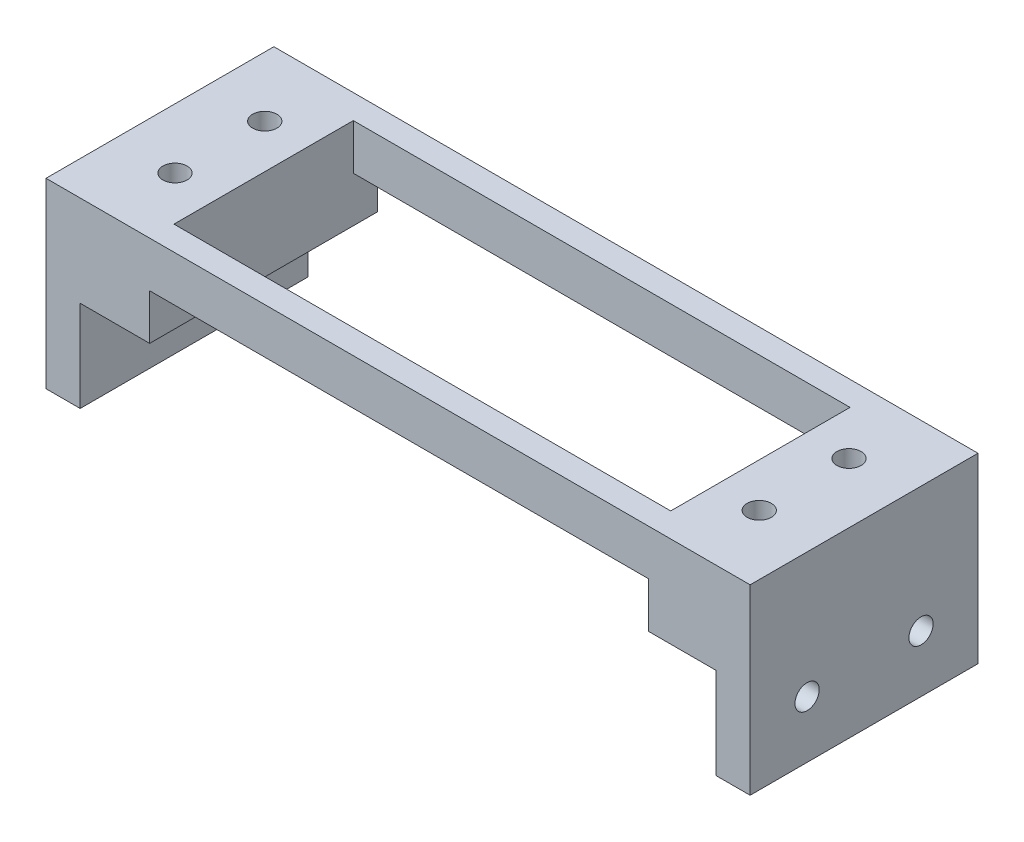
ISO-10303-21;
HEADER;
FILE_DESCRIPTION(('STEP AP214'),'2;1');
FILE_NAME('part.step','',(''),(''),'','','');
FILE_SCHEMA(('AUTOMOTIVE_DESIGN { 1 0 10303 214 1 1 1 1 }'));
ENDSEC;
DATA;
#1=APPLICATION_CONTEXT('core data for automotive mechanical design processes');
#2=APPLICATION_PROTOCOL_DEFINITION('international standard','automotive_design',2000,#1);
#3=PRODUCT_CONTEXT('',#1,'mechanical');
#4=PRODUCT('Part','Part','',(#3));
#5=PRODUCT_RELATED_PRODUCT_CATEGORY('part','',(#4));
#6=PRODUCT_DEFINITION_FORMATION('','',#4);
#7=PRODUCT_DEFINITION_CONTEXT('part definition',#1,'design');
#8=PRODUCT_DEFINITION('design','',#6,#7);
#9=PRODUCT_DEFINITION_SHAPE('','',#8);
#10=(LENGTH_UNIT() NAMED_UNIT(*) SI_UNIT(.MILLI.,.METRE.));
#11=(NAMED_UNIT(*) PLANE_ANGLE_UNIT() SI_UNIT($,.RADIAN.));
#12=(NAMED_UNIT(*) SI_UNIT($,.STERADIAN.) SOLID_ANGLE_UNIT());
#13=UNCERTAINTY_MEASURE_WITH_UNIT(LENGTH_MEASURE(1.E-05),#10,'distance_accuracy_value','');
#14=(GEOMETRIC_REPRESENTATION_CONTEXT(3) GLOBAL_UNCERTAINTY_ASSIGNED_CONTEXT((#13)) GLOBAL_UNIT_ASSIGNED_CONTEXT((#10,
#11,#12)) REPRESENTATION_CONTEXT('',''));
#15=CARTESIAN_POINT('',(0.,0.,0.));
#16=DIRECTION('',(0.,0.,1.));
#17=DIRECTION('',(1.,0.,0.));
#18=AXIS2_PLACEMENT_3D('',#15,#16,#17);
#19=CARTESIAN_POINT('',(0.,0.,0.));
#20=DIRECTION('',(0.,1.,0.));
#21=DIRECTION('',(0.,0.,1.));
#22=AXIS2_PLACEMENT_3D('',#19,#20,#21);
#23=PLANE('',#22);
#24=DIRECTION('',(0.,0.,-1.));
#25=VECTOR('',#24,1.);
#26=CARTESIAN_POINT('',(27.909175520648,0.,12.7));
#27=LINE('',#26,#25);
#28=CARTESIAN_POINT('',(27.909175520648,0.,12.7));
#29=VERTEX_POINT('',#28);
#30=CARTESIAN_POINT('',(27.909175520648,0.,-12.7));
#31=VERTEX_POINT('',#30);
#32=EDGE_CURVE('E199',#29,#31,#27,.T.);
#33=ORIENTED_EDGE('',*,*,#32,.F.);
#34=DIRECTION('',(1.,0.,0.));
#35=VECTOR('',#34,1.);
#36=CARTESIAN_POINT('',(35.433,0.,12.7));
#37=LINE('',#36,#35);
#38=CARTESIAN_POINT('',(-27.686,0.,12.7));
#39=VERTEX_POINT('',#38);
#40=EDGE_CURVE('E263',#39,#29,#37,.T.);
#41=ORIENTED_EDGE('',*,*,#40,.F.);
#42=DIRECTION('',(0.,0.,1.));
#43=VECTOR('',#42,1.);
#44=CARTESIAN_POINT('',(-27.686,0.,12.7));
#45=LINE('',#44,#43);
#46=CARTESIAN_POINT('',(-27.686,0.,9.9949));
#47=VERTEX_POINT('',#46);
#48=EDGE_CURVE('E11',#47,#39,#45,.T.);
#49=ORIENTED_EDGE('',*,*,#48,.F.);
#50=DIRECTION('',(1.,0.,0.));
#51=VECTOR('',#50,1.);
#52=CARTESIAN_POINT('',(27.686,0.,9.9949));
#53=LINE('',#52,#51);
#54=CARTESIAN_POINT('',(27.686,0.,9.9949));
#55=VERTEX_POINT('',#54);
#56=EDGE_CURVE('E236',#47,#55,#53,.T.);
#57=ORIENTED_EDGE('',*,*,#56,.T.);
#58=DIRECTION('',(0.,0.,-1.));
#59=VECTOR('',#58,1.);
#60=CARTESIAN_POINT('',(27.686,0.,9.9949));
#61=LINE('',#60,#59);
#62=CARTESIAN_POINT('',(27.686,0.,-9.9949));
#63=VERTEX_POINT('',#62);
#64=EDGE_CURVE('E250',#55,#63,#61,.T.);
#65=ORIENTED_EDGE('',*,*,#64,.T.);
#66=DIRECTION('',(-1.,0.,0.));
#67=VECTOR('',#66,1.);
#68=CARTESIAN_POINT('',(27.686,0.,-9.9949));
#69=LINE('',#68,#67);
#70=CARTESIAN_POINT('',(-27.686,0.,-9.99489999999999));
#71=VERTEX_POINT('',#70);
#72=EDGE_CURVE('E240',#63,#71,#69,.T.);
#73=ORIENTED_EDGE('',*,*,#72,.T.);
#74=CARTESIAN_POINT('',(-27.686,0.,-12.7));
#75=VERTEX_POINT('',#74);
#76=EDGE_CURVE('E44',#75,#71,#45,.T.);
#77=ORIENTED_EDGE('',*,*,#76,.F.);
#78=DIRECTION('',(-1.,0.,0.));
#79=VECTOR('',#78,1.);
#80=CARTESIAN_POINT('',(35.433,0.,-12.7));
#81=LINE('',#80,#79);
#82=EDGE_CURVE('E37',#31,#75,#81,.T.);
#83=ORIENTED_EDGE('',*,*,#82,.F.);
#84=EDGE_LOOP('',(#33,#41,#49,#57,#65,#73,#77,#83));
#85=FACE_BOUND('',#84,.T.);
#86=ADVANCED_FACE('F33',(#85),#23,.F.);
#87=CARTESIAN_POINT('',(0.,5.08,0.));
#88=DIRECTION('',(0.,1.,0.));
#89=DIRECTION('',(0.,0.,1.));
#90=AXIS2_PLACEMENT_3D('',#87,#88,#89);
#91=PLANE('',#90);
#92=CARTESIAN_POINT('',(-32.5628,5.08,-5.00379999999999));
#93=DIRECTION('',(0.,1.,0.));
#94=DIRECTION('',(0.,0.,1.));
#95=AXIS2_PLACEMENT_3D('',#92,#93,#94);
#96=CIRCLE('',#95,1.35255);
#97=CARTESIAN_POINT('',(-32.5628,5.08,-3.65124999999999));
#98=VERTEX_POINT('',#97);
#99=EDGE_CURVE('E331',#98,#98,#96,.T.);
#100=ORIENTED_EDGE('',*,*,#99,.F.);
#101=EDGE_LOOP('',(#100));
#102=FACE_BOUND('',#101,.T.);
#103=CARTESIAN_POINT('',(-32.5628,5.08,5.00380000000001));
#104=DIRECTION('',(0.,1.,0.));
#105=DIRECTION('',(0.,0.,1.));
#106=AXIS2_PLACEMENT_3D('',#103,#104,#105);
#107=CIRCLE('',#106,1.35255);
#108=CARTESIAN_POINT('',(-32.5628,5.08,6.35635000000001));
#109=VERTEX_POINT('',#108);
#110=EDGE_CURVE('E325',#109,#109,#107,.T.);
#111=ORIENTED_EDGE('',*,*,#110,.F.);
#112=EDGE_LOOP('',(#111));
#113=FACE_BOUND('',#112,.T.);
#114=CARTESIAN_POINT('',(32.5628000000001,5.08,-5.0038));
#115=DIRECTION('',(0.,1.,0.));
#116=DIRECTION('',(0.,0.,1.));
#117=AXIS2_PLACEMENT_3D('',#114,#115,#116);
#118=CIRCLE('',#117,1.35255);
#119=CARTESIAN_POINT('',(32.5628000000001,5.08,-3.65125));
#120=VERTEX_POINT('',#119);
#121=EDGE_CURVE('E319',#120,#120,#118,.T.);
#122=ORIENTED_EDGE('',*,*,#121,.F.);
#123=EDGE_LOOP('',(#122));
#124=FACE_BOUND('',#123,.T.);
#125=CARTESIAN_POINT('',(32.5628000000001,5.08,5.0038));
#126=DIRECTION('',(0.,1.,0.));
#127=DIRECTION('',(0.,0.,1.));
#128=AXIS2_PLACEMENT_3D('',#125,#126,#127);
#129=CIRCLE('',#128,1.35255);
#130=CARTESIAN_POINT('',(32.5628000000001,5.08,6.35635));
#131=VERTEX_POINT('',#130);
#132=EDGE_CURVE('E310',#131,#131,#129,.T.);
#133=ORIENTED_EDGE('',*,*,#132,.F.);
#134=EDGE_LOOP('',(#133));
#135=FACE_BOUND('',#134,.T.);
#136=DIRECTION('',(-1.,0.,0.));
#137=VECTOR('',#136,1.);
#138=CARTESIAN_POINT('',(35.433,5.08,-12.7));
#139=LINE('',#138,#137);
#140=CARTESIAN_POINT('',(39.243,5.08,-12.7));
#141=VERTEX_POINT('',#140);
#142=CARTESIAN_POINT('',(-39.243,5.08,-12.7));
#143=VERTEX_POINT('',#142);
#144=EDGE_CURVE('E42',#141,#143,#139,.T.);
#145=ORIENTED_EDGE('',*,*,#144,.T.);
#146=DIRECTION('',(0.,0.,1.));
#147=VECTOR('',#146,1.);
#148=CARTESIAN_POINT('',(-39.243,5.08,-12.7));
#149=LINE('',#148,#147);
#150=CARTESIAN_POINT('',(-39.243,5.08,12.7));
#151=VERTEX_POINT('',#150);
#152=EDGE_CURVE('E153',#143,#151,#149,.T.);
#153=ORIENTED_EDGE('',*,*,#152,.T.);
#154=DIRECTION('',(1.,0.,0.));
#155=VECTOR('',#154,1.);
#156=CARTESIAN_POINT('',(35.433,5.08,12.7));
#157=LINE('',#156,#155);
#158=CARTESIAN_POINT('',(39.243,5.08,12.7));
#159=VERTEX_POINT('',#158);
#160=EDGE_CURVE('E158',#151,#159,#157,.T.);
#161=ORIENTED_EDGE('',*,*,#160,.T.);
#162=DIRECTION('',(0.,0.,1.));
#163=VECTOR('',#162,1.);
#164=CARTESIAN_POINT('',(39.243,5.08,-12.7));
#165=LINE('',#164,#163);
#166=EDGE_CURVE('E155',#141,#159,#165,.T.);
#167=ORIENTED_EDGE('',*,*,#166,.F.);
#168=EDGE_LOOP('',(#145,#153,#161,#167));
#169=FACE_BOUND('',#168,.T.);
#170=DIRECTION('',(1.,0.,0.));
#171=VECTOR('',#170,1.);
#172=CARTESIAN_POINT('',(27.686,5.08,9.9949));
#173=LINE('',#172,#171);
#174=CARTESIAN_POINT('',(-27.686,5.08,9.9949));
#175=VERTEX_POINT('',#174);
#176=CARTESIAN_POINT('',(27.686,5.08,9.9949));
#177=VERTEX_POINT('',#176);
#178=EDGE_CURVE('E239',#175,#177,#173,.T.);
#179=ORIENTED_EDGE('',*,*,#178,.F.);
#180=DIRECTION('',(0.,0.,1.));
#181=VECTOR('',#180,1.);
#182=CARTESIAN_POINT('',(-27.686,5.08,9.9949));
#183=LINE('',#182,#181);
#184=CARTESIAN_POINT('',(-27.686,5.08,-9.99489999999999));
#185=VERTEX_POINT('',#184);
#186=EDGE_CURVE('E237',#185,#175,#183,.T.);
#187=ORIENTED_EDGE('',*,*,#186,.F.);
#188=DIRECTION('',(-1.,0.,0.));
#189=VECTOR('',#188,1.);
#190=CARTESIAN_POINT('',(27.686,5.08,-9.9949));
#191=LINE('',#190,#189);
#192=CARTESIAN_POINT('',(27.686,5.08,-9.9949));
#193=VERTEX_POINT('',#192);
#194=EDGE_CURVE('E245',#193,#185,#191,.T.);
#195=ORIENTED_EDGE('',*,*,#194,.F.);
#196=DIRECTION('',(0.,0.,-1.));
#197=VECTOR('',#196,1.);
#198=CARTESIAN_POINT('',(27.686,5.08,9.9949));
#199=LINE('',#198,#197);
#200=EDGE_CURVE('E242',#177,#193,#199,.T.);
#201=ORIENTED_EDGE('',*,*,#200,.F.);
#202=EDGE_LOOP('',(#179,#187,#195,#201));
#203=FACE_BOUND('',#202,.T.);
#204=ADVANCED_FACE('F150',(#102,#113,#124,#135,#169,#203),#91,.T.);
#205=CARTESIAN_POINT('',(35.433,5.08,12.7));
#206=DIRECTION('',(0.,0.,-1.));
#207=DIRECTION('',(-1.,0.,0.));
#208=AXIS2_PLACEMENT_3D('',#205,#206,#207);
#209=PLANE('',#208);
#210=ORIENTED_EDGE('',*,*,#160,.F.);
#211=DIRECTION('',(0.,1.,0.));
#212=VECTOR('',#211,1.);
#213=CARTESIAN_POINT('',(-39.243,-5.08,12.7));
#214=LINE('',#213,#212);
#215=CARTESIAN_POINT('',(-39.243,-15.24,12.7));
#216=VERTEX_POINT('',#215);
#217=EDGE_CURVE('E173',#216,#151,#214,.T.);
#218=ORIENTED_EDGE('',*,*,#217,.F.);
#219=DIRECTION('',(-1.,0.,0.));
#220=VECTOR('',#219,1.);
#221=CARTESIAN_POINT('',(-39.243,-15.24,12.7));
#222=LINE('',#221,#220);
#223=CARTESIAN_POINT('',(-35.433,-15.24,12.7));
#224=VERTEX_POINT('',#223);
#225=EDGE_CURVE('E300',#224,#216,#222,.T.);
#226=ORIENTED_EDGE('',*,*,#225,.F.);
#227=DIRECTION('',(0.,-1.,0.));
#228=VECTOR('',#227,1.);
#229=CARTESIAN_POINT('',(-35.433,5.08,12.7));
#230=LINE('',#229,#228);
#231=CARTESIAN_POINT('',(-35.433,-5.08,12.7));
#232=VERTEX_POINT('',#231);
#233=EDGE_CURVE('E168',#232,#224,#230,.T.);
#234=ORIENTED_EDGE('',*,*,#233,.F.);
#235=DIRECTION('',(-1.,0.,0.));
#236=VECTOR('',#235,1.);
#237=CARTESIAN_POINT('',(-35.433,-5.08,12.7));
#238=LINE('',#237,#236);
#239=CARTESIAN_POINT('',(-27.686,-5.08,12.7));
#240=VERTEX_POINT('',#239);
#241=EDGE_CURVE('E226',#240,#232,#238,.T.);
#242=ORIENTED_EDGE('',*,*,#241,.F.);
#243=DIRECTION('',(0.,1.,0.));
#244=VECTOR('',#243,1.);
#245=CARTESIAN_POINT('',(-27.686,-5.08,12.7));
#246=LINE('',#245,#244);
#247=EDGE_CURVE('E228',#240,#39,#246,.T.);
#248=ORIENTED_EDGE('',*,*,#247,.T.);
#249=ORIENTED_EDGE('',*,*,#40,.T.);
#250=DIRECTION('',(0.,1.,0.));
#251=VECTOR('',#250,1.);
#252=CARTESIAN_POINT('',(27.909175520648,-5.08,12.7));
#253=LINE('',#252,#251);
#254=CARTESIAN_POINT('',(27.909175520648,-5.08,12.7));
#255=VERTEX_POINT('',#254);
#256=EDGE_CURVE('E217',#255,#29,#253,.T.);
#257=ORIENTED_EDGE('',*,*,#256,.F.);
#258=DIRECTION('',(-1.,0.,0.));
#259=VECTOR('',#258,1.);
#260=CARTESIAN_POINT('',(35.433,-5.08,12.7));
#261=LINE('',#260,#259);
#262=CARTESIAN_POINT('',(35.433,-5.08,12.7));
#263=VERTEX_POINT('',#262);
#264=EDGE_CURVE('E208',#263,#255,#261,.T.);
#265=ORIENTED_EDGE('',*,*,#264,.F.);
#266=DIRECTION('',(0.,-1.,0.));
#267=VECTOR('',#266,1.);
#268=CARTESIAN_POINT('',(35.433,5.08,12.7));
#269=LINE('',#268,#267);
#270=CARTESIAN_POINT('',(35.433,-15.24,12.7));
#271=VERTEX_POINT('',#270);
#272=EDGE_CURVE('E191',#263,#271,#269,.T.);
#273=ORIENTED_EDGE('',*,*,#272,.T.);
#274=DIRECTION('',(1.,0.,0.));
#275=VECTOR('',#274,1.);
#276=CARTESIAN_POINT('',(39.243,-15.24,12.7));
#277=LINE('',#276,#275);
#278=CARTESIAN_POINT('',(39.243,-15.24,12.7));
#279=VERTEX_POINT('',#278);
#280=EDGE_CURVE('E193',#271,#279,#277,.T.);
#281=ORIENTED_EDGE('',*,*,#280,.T.);
#282=DIRECTION('',(0.,1.,0.));
#283=VECTOR('',#282,1.);
#284=CARTESIAN_POINT('',(39.243,5.08,12.7));
#285=LINE('',#284,#283);
#286=EDGE_CURVE('E185',#279,#159,#285,.T.);
#287=ORIENTED_EDGE('',*,*,#286,.T.);
#288=EDGE_LOOP('',(#210,#218,#226,#234,#242,#248,#249,#257,#265,#273,#281,#287));
#289=FACE_BOUND('',#288,.T.);
#290=ADVANCED_FACE('F35',(#289),#209,.F.);
#291=CARTESIAN_POINT('',(35.433,5.08,-12.7));
#292=DIRECTION('',(0.,0.,1.));
#293=DIRECTION('',(1.,0.,0.));
#294=AXIS2_PLACEMENT_3D('',#291,#292,#293);
#295=PLANE('',#294);
#296=ORIENTED_EDGE('',*,*,#144,.F.);
#297=DIRECTION('',(0.,1.,0.));
#298=VECTOR('',#297,1.);
#299=CARTESIAN_POINT('',(39.243,-5.08,-12.7));
#300=LINE('',#299,#298);
#301=CARTESIAN_POINT('',(39.243,-15.24,-12.7));
#302=VERTEX_POINT('',#301);
#303=EDGE_CURVE('E188',#302,#141,#300,.T.);
#304=ORIENTED_EDGE('',*,*,#303,.F.);
#305=DIRECTION('',(1.,0.,0.));
#306=VECTOR('',#305,1.);
#307=CARTESIAN_POINT('',(39.243,-15.24,-12.7));
#308=LINE('',#307,#306);
#309=CARTESIAN_POINT('',(35.433,-15.24,-12.7));
#310=VERTEX_POINT('',#309);
#311=EDGE_CURVE('E184',#310,#302,#308,.T.);
#312=ORIENTED_EDGE('',*,*,#311,.F.);
#313=DIRECTION('',(0.,-1.,0.));
#314=VECTOR('',#313,1.);
#315=CARTESIAN_POINT('',(35.433,5.08,-12.7));
#316=LINE('',#315,#314);
#317=CARTESIAN_POINT('',(35.433,-5.08,-12.7));
#318=VERTEX_POINT('',#317);
#319=EDGE_CURVE('E182',#318,#310,#316,.T.);
#320=ORIENTED_EDGE('',*,*,#319,.F.);
#321=DIRECTION('',(1.,0.,0.));
#322=VECTOR('',#321,1.);
#323=CARTESIAN_POINT('',(35.433,-5.08,-12.7));
#324=LINE('',#323,#322);
#325=CARTESIAN_POINT('',(27.909175520648,-5.08,-12.7));
#326=VERTEX_POINT('',#325);
#327=EDGE_CURVE('E212',#326,#318,#324,.T.);
#328=ORIENTED_EDGE('',*,*,#327,.F.);
#329=DIRECTION('',(0.,1.,0.));
#330=VECTOR('',#329,1.);
#331=CARTESIAN_POINT('',(27.909175520648,-5.08,-12.7));
#332=LINE('',#331,#330);
#333=EDGE_CURVE('E51',#326,#31,#332,.T.);
#334=ORIENTED_EDGE('',*,*,#333,.T.);
#335=ORIENTED_EDGE('',*,*,#82,.T.);
#336=DIRECTION('',(0.,1.,0.));
#337=VECTOR('',#336,1.);
#338=CARTESIAN_POINT('',(-27.686,-5.08,-12.7));
#339=LINE('',#338,#337);
#340=CARTESIAN_POINT('',(-27.686,-5.08,-12.7));
#341=VERTEX_POINT('',#340);
#342=EDGE_CURVE('E233',#341,#75,#339,.T.);
#343=ORIENTED_EDGE('',*,*,#342,.F.);
#344=DIRECTION('',(1.,0.,0.));
#345=VECTOR('',#344,1.);
#346=CARTESIAN_POINT('',(-35.433,-5.08,-12.7));
#347=LINE('',#346,#345);
#348=CARTESIAN_POINT('',(-35.433,-5.08,-12.7));
#349=VERTEX_POINT('',#348);
#350=EDGE_CURVE('E222',#349,#341,#347,.T.);
#351=ORIENTED_EDGE('',*,*,#350,.F.);
#352=DIRECTION('',(0.,-1.,0.));
#353=VECTOR('',#352,1.);
#354=CARTESIAN_POINT('',(-35.433,5.08,-12.7));
#355=LINE('',#354,#353);
#356=CARTESIAN_POINT('',(-35.433,-15.24,-12.7));
#357=VERTEX_POINT('',#356);
#358=EDGE_CURVE('E175',#349,#357,#355,.T.);
#359=ORIENTED_EDGE('',*,*,#358,.T.);
#360=DIRECTION('',(-1.,0.,0.));
#361=VECTOR('',#360,1.);
#362=CARTESIAN_POINT('',(-39.243,-15.24,-12.7));
#363=LINE('',#362,#361);
#364=CARTESIAN_POINT('',(-39.243,-15.24,-12.7));
#365=VERTEX_POINT('',#364);
#366=EDGE_CURVE('E164',#357,#365,#363,.T.);
#367=ORIENTED_EDGE('',*,*,#366,.T.);
#368=DIRECTION('',(0.,1.,0.));
#369=VECTOR('',#368,1.);
#370=CARTESIAN_POINT('',(-39.243,5.08,-12.7));
#371=LINE('',#370,#369);
#372=EDGE_CURVE('E161',#365,#143,#371,.T.);
#373=ORIENTED_EDGE('',*,*,#372,.T.);
#374=EDGE_LOOP('',(#296,#304,#312,#320,#328,#334,#335,#343,#351,#359,#367,#373));
#375=FACE_BOUND('',#374,.T.);
#376=ADVANCED_FACE('F162',(#375),#295,.F.);
#377=CARTESIAN_POINT('',(-27.686,5.08,9.9949));
#378=DIRECTION('',(1.,0.,0.));
#379=DIRECTION('',(0.,0.,-1.));
#380=AXIS2_PLACEMENT_3D('',#377,#378,#379);
#381=PLANE('',#380);
#382=DIRECTION('',(0.,-1.,0.));
#383=VECTOR('',#382,1.);
#384=CARTESIAN_POINT('',(-27.686,5.08,9.9949));
#385=LINE('',#384,#383);
#386=EDGE_CURVE('E260',#175,#47,#385,.T.);
#387=ORIENTED_EDGE('',*,*,#386,.T.);
#388=ORIENTED_EDGE('',*,*,#48,.T.);
#389=ORIENTED_EDGE('',*,*,#247,.F.);
#390=DIRECTION('',(0.,0.,1.));
#391=VECTOR('',#390,1.);
#392=CARTESIAN_POINT('',(-27.686,-5.08,12.7));
#393=LINE('',#392,#391);
#394=EDGE_CURVE('E224',#341,#240,#393,.T.);
#395=ORIENTED_EDGE('',*,*,#394,.F.);
#396=ORIENTED_EDGE('',*,*,#342,.T.);
#397=ORIENTED_EDGE('',*,*,#76,.T.);
#398=DIRECTION('',(0.,-1.,0.));
#399=VECTOR('',#398,1.);
#400=CARTESIAN_POINT('',(-27.686,5.08,-9.99489999999999));
#401=LINE('',#400,#399);
#402=EDGE_CURVE('E247',#185,#71,#401,.T.);
#403=ORIENTED_EDGE('',*,*,#402,.F.);
#404=ORIENTED_EDGE('',*,*,#186,.T.);
#405=EDGE_LOOP('',(#387,#388,#389,#395,#396,#397,#403,#404));
#406=FACE_BOUND('',#405,.T.);
#407=ADVANCED_FACE('F275',(#406),#381,.T.);
#408=CARTESIAN_POINT('',(27.686,5.08,9.9949));
#409=DIRECTION('',(0.,0.,-1.));
#410=DIRECTION('',(-1.,0.,0.));
#411=AXIS2_PLACEMENT_3D('',#408,#409,#410);
#412=PLANE('',#411);
#413=ORIENTED_EDGE('',*,*,#56,.F.);
#414=ORIENTED_EDGE('',*,*,#386,.F.);
#415=ORIENTED_EDGE('',*,*,#178,.T.);
#416=DIRECTION('',(0.,-1.,0.));
#417=VECTOR('',#416,1.);
#418=CARTESIAN_POINT('',(27.686,5.08,9.9949));
#419=LINE('',#418,#417);
#420=EDGE_CURVE('E258',#177,#55,#419,.T.);
#421=ORIENTED_EDGE('',*,*,#420,.T.);
#422=EDGE_LOOP('',(#413,#414,#415,#421));
#423=FACE_BOUND('',#422,.T.);
#424=ADVANCED_FACE('F282',(#423),#412,.T.);
#425=CARTESIAN_POINT('',(27.686,5.08,9.9949));
#426=DIRECTION('',(-1.,0.,0.));
#427=DIRECTION('',(0.,0.,1.));
#428=AXIS2_PLACEMENT_3D('',#425,#426,#427);
#429=PLANE('',#428);
#430=ORIENTED_EDGE('',*,*,#64,.F.);
#431=ORIENTED_EDGE('',*,*,#420,.F.);
#432=ORIENTED_EDGE('',*,*,#200,.T.);
#433=DIRECTION('',(0.,-1.,0.));
#434=VECTOR('',#433,1.);
#435=CARTESIAN_POINT('',(27.686,5.08,-9.9949));
#436=LINE('',#435,#434);
#437=EDGE_CURVE('E256',#193,#63,#436,.T.);
#438=ORIENTED_EDGE('',*,*,#437,.T.);
#439=EDGE_LOOP('',(#430,#431,#432,#438));
#440=FACE_BOUND('',#439,.T.);
#441=ADVANCED_FACE('F288',(#440),#429,.T.);
#442=CARTESIAN_POINT('',(27.686,5.08,-9.9949));
#443=DIRECTION('',(0.,0.,1.));
#444=DIRECTION('',(1.,0.,0.));
#445=AXIS2_PLACEMENT_3D('',#442,#443,#444);
#446=PLANE('',#445);
#447=ORIENTED_EDGE('',*,*,#72,.F.);
#448=ORIENTED_EDGE('',*,*,#437,.F.);
#449=ORIENTED_EDGE('',*,*,#194,.T.);
#450=ORIENTED_EDGE('',*,*,#402,.T.);
#451=EDGE_LOOP('',(#447,#448,#449,#450));
#452=FACE_BOUND('',#451,.T.);
#453=ADVANCED_FACE('F387',(#452),#446,.T.);
#454=CARTESIAN_POINT('',(0.,-5.08,0.));
#455=DIRECTION('',(0.,-1.,0.));
#456=DIRECTION('',(0.,0.,-1.));
#457=AXIS2_PLACEMENT_3D('',#454,#455,#456);
#458=PLANE('',#457);
#459=CARTESIAN_POINT('',(-32.5628,-5.08,-5.00379999999999));
#460=DIRECTION('',(0.,1.,0.));
#461=DIRECTION('',(0.,0.,1.));
#462=AXIS2_PLACEMENT_3D('',#459,#460,#461);
#463=CIRCLE('',#462,1.35255);
#464=CARTESIAN_POINT('',(-32.5628,-5.08,-3.65124999999999));
#465=VERTEX_POINT('',#464);
#466=EDGE_CURVE('E328',#465,#465,#463,.T.);
#467=ORIENTED_EDGE('',*,*,#466,.T.);
#468=EDGE_LOOP('',(#467));
#469=FACE_BOUND('',#468,.T.);
#470=CARTESIAN_POINT('',(-32.5628,-5.08,5.00380000000001));
#471=DIRECTION('',(0.,1.,0.));
#472=DIRECTION('',(0.,0.,1.));
#473=AXIS2_PLACEMENT_3D('',#470,#471,#472);
#474=CIRCLE('',#473,1.35255);
#475=CARTESIAN_POINT('',(-32.5628,-5.08,6.35635000000001));
#476=VERTEX_POINT('',#475);
#477=EDGE_CURVE('E322',#476,#476,#474,.T.);
#478=ORIENTED_EDGE('',*,*,#477,.T.);
#479=EDGE_LOOP('',(#478));
#480=FACE_BOUND('',#479,.T.);
#481=DIRECTION('',(0.,0.,-1.));
#482=VECTOR('',#481,1.);
#483=CARTESIAN_POINT('',(-35.433,-5.08,12.7));
#484=LINE('',#483,#482);
#485=EDGE_CURVE('E219',#232,#349,#484,.T.);
#486=ORIENTED_EDGE('',*,*,#485,.T.);
#487=ORIENTED_EDGE('',*,*,#350,.T.);
#488=ORIENTED_EDGE('',*,*,#394,.T.);
#489=ORIENTED_EDGE('',*,*,#241,.T.);
#490=EDGE_LOOP('',(#486,#487,#488,#489));
#491=FACE_BOUND('',#490,.T.);
#492=ADVANCED_FACE('F294',(#469,#480,#491),#458,.T.);
#493=CARTESIAN_POINT('',(27.909175520648,-5.08,12.7));
#494=DIRECTION('',(1.,0.,0.));
#495=DIRECTION('',(0.,0.,-1.));
#496=AXIS2_PLACEMENT_3D('',#493,#494,#495);
#497=PLANE('',#496);
#498=ORIENTED_EDGE('',*,*,#32,.T.);
#499=ORIENTED_EDGE('',*,*,#333,.F.);
#500=DIRECTION('',(0.,0.,-1.));
#501=VECTOR('',#500,1.);
#502=CARTESIAN_POINT('',(27.909175520648,-5.08,12.7));
#503=LINE('',#502,#501);
#504=EDGE_CURVE('E210',#255,#326,#503,.T.);
#505=ORIENTED_EDGE('',*,*,#504,.F.);
#506=ORIENTED_EDGE('',*,*,#256,.T.);
#507=EDGE_LOOP('',(#498,#499,#505,#506));
#508=FACE_BOUND('',#507,.T.);
#509=ADVANCED_FACE('F378',(#508),#497,.F.);
#510=CARTESIAN_POINT('',(0.,-5.08,0.));
#511=DIRECTION('',(0.,1.,0.));
#512=DIRECTION('',(0.,0.,1.));
#513=AXIS2_PLACEMENT_3D('',#510,#511,#512);
#514=PLANE('',#513);
#515=CARTESIAN_POINT('',(32.5628000000001,-5.08,-5.0038));
#516=DIRECTION('',(0.,1.,0.));
#517=DIRECTION('',(0.,0.,1.));
#518=AXIS2_PLACEMENT_3D('',#515,#516,#517);
#519=CIRCLE('',#518,1.35254999999999);
#520=CARTESIAN_POINT('',(32.5628000000001,-5.08,-3.65125));
#521=VERTEX_POINT('',#520);
#522=EDGE_CURVE('E314',#521,#521,#519,.T.);
#523=ORIENTED_EDGE('',*,*,#522,.T.);
#524=EDGE_LOOP('',(#523));
#525=FACE_BOUND('',#524,.T.);
#526=CARTESIAN_POINT('',(32.5628000000001,-5.08,5.0038));
#527=DIRECTION('',(0.,1.,0.));
#528=DIRECTION('',(0.,0.,1.));
#529=AXIS2_PLACEMENT_3D('',#526,#527,#528);
#530=CIRCLE('',#529,1.35254999999999);
#531=CARTESIAN_POINT('',(32.5628000000001,-5.08,6.35635));
#532=VERTEX_POINT('',#531);
#533=EDGE_CURVE('E308',#532,#532,#530,.T.);
#534=ORIENTED_EDGE('',*,*,#533,.T.);
#535=EDGE_LOOP('',(#534));
#536=FACE_BOUND('',#535,.T.);
#537=DIRECTION('',(0.,0.,1.));
#538=VECTOR('',#537,1.);
#539=CARTESIAN_POINT('',(35.433,-5.08,12.7));
#540=LINE('',#539,#538);
#541=EDGE_CURVE('E205',#318,#263,#540,.T.);
#542=ORIENTED_EDGE('',*,*,#541,.T.);
#543=ORIENTED_EDGE('',*,*,#264,.T.);
#544=ORIENTED_EDGE('',*,*,#504,.T.);
#545=ORIENTED_EDGE('',*,*,#327,.T.);
#546=EDGE_LOOP('',(#542,#543,#544,#545));
#547=FACE_BOUND('',#546,.T.);
#548=ADVANCED_FACE('F376',(#525,#536,#547),#514,.F.);
#549=CARTESIAN_POINT('',(35.433,5.08,-12.7));
#550=DIRECTION('',(-1.,0.,0.));
#551=DIRECTION('',(0.,0.,1.));
#552=AXIS2_PLACEMENT_3D('',#549,#550,#551);
#553=PLANE('',#552);
#554=CARTESIAN_POINT('',(35.433,-8.89,-6.35));
#555=DIRECTION('',(-1.,0.,0.));
#556=DIRECTION('',(0.,0.,1.));
#557=AXIS2_PLACEMENT_3D('',#554,#555,#556);
#558=CIRCLE('',#557,1.35254999999999);
#559=CARTESIAN_POINT('',(35.433,-8.89,-4.99745000000001));
#560=VERTEX_POINT('',#559);
#561=EDGE_CURVE('E352',#560,#560,#558,.T.);
#562=ORIENTED_EDGE('',*,*,#561,.F.);
#563=EDGE_LOOP('',(#562));
#564=FACE_BOUND('',#563,.T.);
#565=CARTESIAN_POINT('',(35.433,-8.89,6.35));
#566=DIRECTION('',(-1.,0.,0.));
#567=DIRECTION('',(0.,0.,1.));
#568=AXIS2_PLACEMENT_3D('',#565,#566,#567);
#569=CIRCLE('',#568,1.35254999999999);
#570=CARTESIAN_POINT('',(35.433,-8.89,7.70254999999999));
#571=VERTEX_POINT('',#570);
#572=EDGE_CURVE('E346',#571,#571,#569,.T.);
#573=ORIENTED_EDGE('',*,*,#572,.F.);
#574=EDGE_LOOP('',(#573));
#575=FACE_BOUND('',#574,.T.);
#576=ORIENTED_EDGE('',*,*,#541,.F.);
#577=ORIENTED_EDGE('',*,*,#319,.T.);
#578=DIRECTION('',(0.,0.,1.));
#579=VECTOR('',#578,1.);
#580=CARTESIAN_POINT('',(35.433,-15.24,-12.7));
#581=LINE('',#580,#579);
#582=EDGE_CURVE('E190',#310,#271,#581,.T.);
#583=ORIENTED_EDGE('',*,*,#582,.T.);
#584=ORIENTED_EDGE('',*,*,#272,.F.);
#585=EDGE_LOOP('',(#576,#577,#583,#584));
#586=FACE_BOUND('',#585,.T.);
#587=ADVANCED_FACE('F365',(#564,#575,#586),#553,.T.);
#588=CARTESIAN_POINT('',(39.243,5.08,-12.7));
#589=DIRECTION('',(1.,0.,0.));
#590=DIRECTION('',(0.,0.,-1.));
#591=AXIS2_PLACEMENT_3D('',#588,#589,#590);
#592=PLANE('',#591);
#593=CARTESIAN_POINT('',(39.243,-8.89,-6.35));
#594=DIRECTION('',(1.,0.,0.));
#595=DIRECTION('',(0.,0.,-1.));
#596=AXIS2_PLACEMENT_3D('',#593,#594,#595);
#597=CIRCLE('',#596,1.35254999999999);
#598=CARTESIAN_POINT('',(39.243,-8.89,-7.70254999999999));
#599=VERTEX_POINT('',#598);
#600=EDGE_CURVE('E355',#599,#599,#597,.T.);
#601=ORIENTED_EDGE('',*,*,#600,.F.);
#602=EDGE_LOOP('',(#601));
#603=FACE_BOUND('',#602,.T.);
#604=CARTESIAN_POINT('',(39.243,-8.89,6.35));
#605=DIRECTION('',(1.,0.,0.));
#606=DIRECTION('',(0.,0.,-1.));
#607=AXIS2_PLACEMENT_3D('',#604,#605,#606);
#608=CIRCLE('',#607,1.35254999999999);
#609=CARTESIAN_POINT('',(39.243,-8.89,4.99745000000001));
#610=VERTEX_POINT('',#609);
#611=EDGE_CURVE('E349',#610,#610,#608,.T.);
#612=ORIENTED_EDGE('',*,*,#611,.F.);
#613=EDGE_LOOP('',(#612));
#614=FACE_BOUND('',#613,.T.);
#615=ORIENTED_EDGE('',*,*,#286,.F.);
#616=DIRECTION('',(0.,0.,1.));
#617=VECTOR('',#616,1.);
#618=CARTESIAN_POINT('',(39.243,-15.24,-12.7));
#619=LINE('',#618,#617);
#620=EDGE_CURVE('E200',#302,#279,#619,.T.);
#621=ORIENTED_EDGE('',*,*,#620,.F.);
#622=ORIENTED_EDGE('',*,*,#303,.T.);
#623=ORIENTED_EDGE('',*,*,#166,.T.);
#624=EDGE_LOOP('',(#615,#621,#622,#623));
#625=FACE_BOUND('',#624,.T.);
#626=ADVANCED_FACE('F361',(#603,#614,#625),#592,.T.);
#627=CARTESIAN_POINT('',(39.243,-15.24,-12.7));
#628=DIRECTION('',(0.,-1.,0.));
#629=DIRECTION('',(0.,0.,-1.));
#630=AXIS2_PLACEMENT_3D('',#627,#628,#629);
#631=PLANE('',#630);
#632=ORIENTED_EDGE('',*,*,#280,.F.);
#633=ORIENTED_EDGE('',*,*,#582,.F.);
#634=ORIENTED_EDGE('',*,*,#311,.T.);
#635=ORIENTED_EDGE('',*,*,#620,.T.);
#636=EDGE_LOOP('',(#632,#633,#634,#635));
#637=FACE_BOUND('',#636,.T.);
#638=ADVANCED_FACE('F364',(#637),#631,.T.);
#639=CARTESIAN_POINT('',(-35.433,5.08,-12.7));
#640=DIRECTION('',(-1.,0.,0.));
#641=DIRECTION('',(0.,0.,1.));
#642=AXIS2_PLACEMENT_3D('',#639,#640,#641);
#643=PLANE('',#642);
#644=CARTESIAN_POINT('',(-35.433,-8.89,-6.35));
#645=DIRECTION('',(-1.,0.,0.));
#646=DIRECTION('',(0.,0.,1.));
#647=AXIS2_PLACEMENT_3D('',#644,#645,#646);
#648=CIRCLE('',#647,1.35254999999999);
#649=CARTESIAN_POINT('',(-35.433,-8.89,-4.99745000000001));
#650=VERTEX_POINT('',#649);
#651=EDGE_CURVE('E340',#650,#650,#648,.T.);
#652=ORIENTED_EDGE('',*,*,#651,.T.);
#653=EDGE_LOOP('',(#652));
#654=FACE_BOUND('',#653,.T.);
#655=CARTESIAN_POINT('',(-35.433,-8.89,6.35));
#656=DIRECTION('',(-1.,0.,0.));
#657=DIRECTION('',(0.,0.,1.));
#658=AXIS2_PLACEMENT_3D('',#655,#656,#657);
#659=CIRCLE('',#658,1.35254999999999);
#660=CARTESIAN_POINT('',(-35.433,-8.89,7.70254999999999));
#661=VERTEX_POINT('',#660);
#662=EDGE_CURVE('E334',#661,#661,#659,.T.);
#663=ORIENTED_EDGE('',*,*,#662,.T.);
#664=EDGE_LOOP('',(#663));
#665=FACE_BOUND('',#664,.T.);
#666=ORIENTED_EDGE('',*,*,#485,.F.);
#667=ORIENTED_EDGE('',*,*,#233,.T.);
#668=DIRECTION('',(0.,0.,1.));
#669=VECTOR('',#668,1.);
#670=CARTESIAN_POINT('',(-35.433,-15.24,-12.7));
#671=LINE('',#670,#669);
#672=EDGE_CURVE('E177',#357,#224,#671,.T.);
#673=ORIENTED_EDGE('',*,*,#672,.F.);
#674=ORIENTED_EDGE('',*,*,#358,.F.);
#675=EDGE_LOOP('',(#666,#667,#673,#674));
#676=FACE_BOUND('',#675,.T.);
#677=ADVANCED_FACE('F297',(#654,#665,#676),#643,.F.);
#678=CARTESIAN_POINT('',(-39.243,-15.24,-12.7));
#679=DIRECTION('',(0.,1.,0.));
#680=DIRECTION('',(0.,0.,1.));
#681=AXIS2_PLACEMENT_3D('',#678,#679,#680);
#682=PLANE('',#681);
#683=ORIENTED_EDGE('',*,*,#225,.T.);
#684=DIRECTION('',(0.,0.,1.));
#685=VECTOR('',#684,1.);
#686=CARTESIAN_POINT('',(-39.243,-15.24,-12.7));
#687=LINE('',#686,#685);
#688=EDGE_CURVE('E174',#365,#216,#687,.T.);
#689=ORIENTED_EDGE('',*,*,#688,.F.);
#690=ORIENTED_EDGE('',*,*,#366,.F.);
#691=ORIENTED_EDGE('',*,*,#672,.T.);
#692=EDGE_LOOP('',(#683,#689,#690,#691));
#693=FACE_BOUND('',#692,.T.);
#694=ADVANCED_FACE('F305',(#693),#682,.F.);
#695=CARTESIAN_POINT('',(-39.243,-5.08,-12.7));
#696=DIRECTION('',(1.,0.,0.));
#697=DIRECTION('',(0.,0.,-1.));
#698=AXIS2_PLACEMENT_3D('',#695,#696,#697);
#699=PLANE('',#698);
#700=CARTESIAN_POINT('',(-39.243,-8.89,-6.35));
#701=DIRECTION('',(-1.,0.,0.));
#702=DIRECTION('',(0.,0.,1.));
#703=AXIS2_PLACEMENT_3D('',#700,#701,#702);
#704=CIRCLE('',#703,1.35254999999999);
#705=CARTESIAN_POINT('',(-39.243,-8.89,-4.99745000000001));
#706=VERTEX_POINT('',#705);
#707=EDGE_CURVE('E343',#706,#706,#704,.T.);
#708=ORIENTED_EDGE('',*,*,#707,.F.);
#709=EDGE_LOOP('',(#708));
#710=FACE_BOUND('',#709,.T.);
#711=CARTESIAN_POINT('',(-39.243,-8.89,6.35));
#712=DIRECTION('',(-1.,0.,0.));
#713=DIRECTION('',(0.,0.,1.));
#714=AXIS2_PLACEMENT_3D('',#711,#712,#713);
#715=CIRCLE('',#714,1.35254999999999);
#716=CARTESIAN_POINT('',(-39.243,-8.89,7.70254999999999));
#717=VERTEX_POINT('',#716);
#718=EDGE_CURVE('E337',#717,#717,#715,.T.);
#719=ORIENTED_EDGE('',*,*,#718,.F.);
#720=EDGE_LOOP('',(#719));
#721=FACE_BOUND('',#720,.T.);
#722=ORIENTED_EDGE('',*,*,#217,.T.);
#723=ORIENTED_EDGE('',*,*,#152,.F.);
#724=ORIENTED_EDGE('',*,*,#372,.F.);
#725=ORIENTED_EDGE('',*,*,#688,.T.);
#726=EDGE_LOOP('',(#722,#723,#724,#725));
#727=FACE_BOUND('',#726,.T.);
#728=ADVANCED_FACE('F171',(#710,#721,#727),#699,.F.);
#729=CARTESIAN_POINT('',(32.5628000000001,5.08,5.0038));
#730=DIRECTION('',(0.,1.,0.));
#731=DIRECTION('',(0.,0.,1.));
#732=AXIS2_PLACEMENT_3D('',#729,#730,#731);
#733=CYLINDRICAL_SURFACE('',#732,1.35255);
#734=ORIENTED_EDGE('',*,*,#533,.F.);
#735=EDGE_LOOP('',(#734));
#736=FACE_BOUND('',#735,.T.);
#737=ORIENTED_EDGE('',*,*,#132,.T.);
#738=EDGE_LOOP('',(#737));
#739=FACE_BOUND('',#738,.T.);
#740=ADVANCED_FACE('F437',(#736,#739),#733,.F.);
#741=CARTESIAN_POINT('',(32.5628000000001,5.08,-5.0038));
#742=DIRECTION('',(0.,1.,0.));
#743=DIRECTION('',(0.,0.,1.));
#744=AXIS2_PLACEMENT_3D('',#741,#742,#743);
#745=CYLINDRICAL_SURFACE('',#744,1.35255);
#746=ORIENTED_EDGE('',*,*,#522,.F.);
#747=EDGE_LOOP('',(#746));
#748=FACE_BOUND('',#747,.T.);
#749=ORIENTED_EDGE('',*,*,#121,.T.);
#750=EDGE_LOOP('',(#749));
#751=FACE_BOUND('',#750,.T.);
#752=ADVANCED_FACE('F442',(#748,#751),#745,.F.);
#753=CARTESIAN_POINT('',(-32.5628,5.08,5.00380000000001));
#754=DIRECTION('',(0.,1.,0.));
#755=DIRECTION('',(0.,0.,1.));
#756=AXIS2_PLACEMENT_3D('',#753,#754,#755);
#757=CYLINDRICAL_SURFACE('',#756,1.35255);
#758=ORIENTED_EDGE('',*,*,#477,.F.);
#759=EDGE_LOOP('',(#758));
#760=FACE_BOUND('',#759,.T.);
#761=ORIENTED_EDGE('',*,*,#110,.T.);
#762=EDGE_LOOP('',(#761));
#763=FACE_BOUND('',#762,.T.);
#764=ADVANCED_FACE('F454',(#760,#763),#757,.F.);
#765=CARTESIAN_POINT('',(-32.5628,5.08,-5.00379999999999));
#766=DIRECTION('',(0.,1.,0.));
#767=DIRECTION('',(0.,0.,1.));
#768=AXIS2_PLACEMENT_3D('',#765,#766,#767);
#769=CYLINDRICAL_SURFACE('',#768,1.35255);
#770=ORIENTED_EDGE('',*,*,#466,.F.);
#771=EDGE_LOOP('',(#770));
#772=FACE_BOUND('',#771,.T.);
#773=ORIENTED_EDGE('',*,*,#99,.T.);
#774=EDGE_LOOP('',(#773));
#775=FACE_BOUND('',#774,.T.);
#776=ADVANCED_FACE('F464',(#772,#775),#769,.F.);
#777=CARTESIAN_POINT('',(-39.243,-8.89,6.35));
#778=DIRECTION('',(-1.,0.,0.));
#779=DIRECTION('',(0.,0.,1.));
#780=AXIS2_PLACEMENT_3D('',#777,#778,#779);
#781=CYLINDRICAL_SURFACE('',#780,1.35254999999999);
#782=ORIENTED_EDGE('',*,*,#718,.T.);
#783=EDGE_LOOP('',(#782));
#784=FACE_BOUND('',#783,.T.);
#785=ORIENTED_EDGE('',*,*,#662,.F.);
#786=EDGE_LOOP('',(#785));
#787=FACE_BOUND('',#786,.T.);
#788=ADVANCED_FACE('F474',(#784,#787),#781,.F.);
#789=CARTESIAN_POINT('',(-39.243,-8.89,-6.35));
#790=DIRECTION('',(-1.,0.,0.));
#791=DIRECTION('',(0.,0.,1.));
#792=AXIS2_PLACEMENT_3D('',#789,#790,#791);
#793=CYLINDRICAL_SURFACE('',#792,1.35254999999999);
#794=ORIENTED_EDGE('',*,*,#707,.T.);
#795=EDGE_LOOP('',(#794));
#796=FACE_BOUND('',#795,.T.);
#797=ORIENTED_EDGE('',*,*,#651,.F.);
#798=EDGE_LOOP('',(#797));
#799=FACE_BOUND('',#798,.T.);
#800=ADVANCED_FACE('F497',(#796,#799),#793,.F.);
#801=CARTESIAN_POINT('',(39.243,-8.89,6.35));
#802=DIRECTION('',(1.,0.,0.));
#803=DIRECTION('',(0.,0.,-1.));
#804=AXIS2_PLACEMENT_3D('',#801,#802,#803);
#805=CYLINDRICAL_SURFACE('',#804,1.35254999999999);
#806=ORIENTED_EDGE('',*,*,#572,.T.);
#807=EDGE_LOOP('',(#806));
#808=FACE_BOUND('',#807,.T.);
#809=ORIENTED_EDGE('',*,*,#611,.T.);
#810=EDGE_LOOP('',(#809));
#811=FACE_BOUND('',#810,.T.);
#812=ADVANCED_FACE('F507',(#808,#811),#805,.F.);
#813=CARTESIAN_POINT('',(39.243,-8.89,-6.35));
#814=DIRECTION('',(1.,0.,0.));
#815=DIRECTION('',(0.,0.,-1.));
#816=AXIS2_PLACEMENT_3D('',#813,#814,#815);
#817=CYLINDRICAL_SURFACE('',#816,1.35254999999999);
#818=ORIENTED_EDGE('',*,*,#561,.T.);
#819=EDGE_LOOP('',(#818));
#820=FACE_BOUND('',#819,.T.);
#821=ORIENTED_EDGE('',*,*,#600,.T.);
#822=EDGE_LOOP('',(#821));
#823=FACE_BOUND('',#822,.T.);
#824=ADVANCED_FACE('F359',(#820,#823),#817,.F.);
#825=CLOSED_SHELL('',(#86,#204,#290,#376,#407,#424,#441,#453,#492,#509,#548,#587,#626,#638,#677,
#694,#728,#740,#752,#764,#776,#788,#800,#812,#824));
#826=MANIFOLD_SOLID_BREP('B2',#825);
#827=ADVANCED_BREP_SHAPE_REPRESENTATION('',(#18,#826),#14);
#828=SHAPE_DEFINITION_REPRESENTATION(#9,#827);
ENDSEC;
END-ISO-10303-21;
